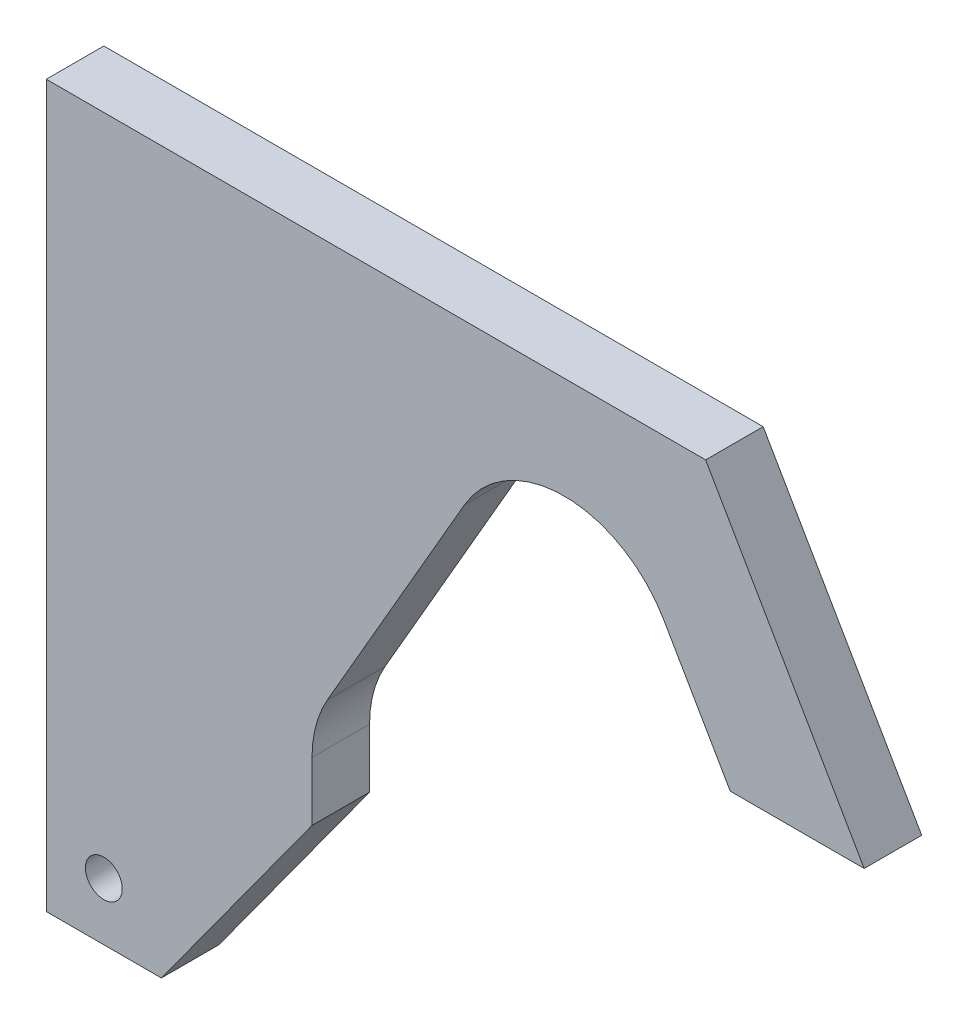
ISO-10303-21;
HEADER;
FILE_DESCRIPTION(('STEP AP214'),'2;1');
FILE_NAME('part.step','',(''),(''),'','','');
FILE_SCHEMA(('AUTOMOTIVE_DESIGN { 1 0 10303 214 1 1 1 1 }'));
ENDSEC;
DATA;
#1=APPLICATION_CONTEXT('core data for automotive mechanical design processes');
#2=APPLICATION_PROTOCOL_DEFINITION('international standard','automotive_design',2000,#1);
#3=PRODUCT_CONTEXT('',#1,'mechanical');
#4=PRODUCT('Part','Part','',(#3));
#5=PRODUCT_RELATED_PRODUCT_CATEGORY('part','',(#4));
#6=PRODUCT_DEFINITION_FORMATION('','',#4);
#7=PRODUCT_DEFINITION_CONTEXT('part definition',#1,'design');
#8=PRODUCT_DEFINITION('design','',#6,#7);
#9=PRODUCT_DEFINITION_SHAPE('','',#8);
#10=(LENGTH_UNIT() NAMED_UNIT(*) SI_UNIT(.MILLI.,.METRE.));
#11=(NAMED_UNIT(*) PLANE_ANGLE_UNIT() SI_UNIT($,.RADIAN.));
#12=(NAMED_UNIT(*) SI_UNIT($,.STERADIAN.) SOLID_ANGLE_UNIT());
#13=UNCERTAINTY_MEASURE_WITH_UNIT(LENGTH_MEASURE(1.E-05),#10,'distance_accuracy_value','');
#14=(GEOMETRIC_REPRESENTATION_CONTEXT(3) GLOBAL_UNCERTAINTY_ASSIGNED_CONTEXT((#13)) GLOBAL_UNIT_ASSIGNED_CONTEXT((#10,
#11,#12)) REPRESENTATION_CONTEXT('',''));
#15=CARTESIAN_POINT('',(0.,0.,0.));
#16=DIRECTION('',(0.,0.,1.));
#17=DIRECTION('',(1.,0.,0.));
#18=AXIS2_PLACEMENT_3D('',#15,#16,#17);
#19=CARTESIAN_POINT('',(0.,0.,6.35));
#20=DIRECTION('',(0.,0.,-1.));
#21=DIRECTION('',(-1.,0.,0.));
#22=AXIS2_PLACEMENT_3D('',#19,#20,#21);
#23=CYLINDRICAL_SURFACE('',#22,12.7);
#24=CARTESIAN_POINT('',(0.,0.,0.));
#25=DIRECTION('',(0.,0.,-1.));
#26=DIRECTION('',(1.,0.,0.));
#27=AXIS2_PLACEMENT_3D('',#24,#25,#26);
#28=CIRCLE('',#27,12.7);
#29=CARTESIAN_POINT('',(-10.9985226280624,6.35000000000001,0.));
#30=VERTEX_POINT('',#29);
#31=CARTESIAN_POINT('',(10.9985226280624,6.35000000000001,0.));
#32=VERTEX_POINT('',#31);
#33=EDGE_CURVE('E183',#30,#32,#28,.T.);
#34=ORIENTED_EDGE('',*,*,#33,.T.);
#35=DIRECTION('',(0.,0.,-1.));
#36=VECTOR('',#35,1.);
#37=CARTESIAN_POINT('',(10.9985226280624,6.35000000000001,6.35));
#38=LINE('',#37,#36);
#39=CARTESIAN_POINT('',(10.9985226280624,6.35000000000001,6.35));
#40=VERTEX_POINT('',#39);
#41=EDGE_CURVE('E11',#40,#32,#38,.T.);
#42=ORIENTED_EDGE('',*,*,#41,.F.);
#43=CARTESIAN_POINT('',(0.,0.,6.35));
#44=DIRECTION('',(0.,0.,-1.));
#45=DIRECTION('',(1.,0.,0.));
#46=AXIS2_PLACEMENT_3D('',#43,#44,#45);
#47=CIRCLE('',#46,12.7);
#48=CARTESIAN_POINT('',(-10.9985226280624,6.35000000000001,6.35));
#49=VERTEX_POINT('',#48);
#50=EDGE_CURVE('E215',#49,#40,#47,.T.);
#51=ORIENTED_EDGE('',*,*,#50,.F.);
#52=DIRECTION('',(0.,0.,-1.));
#53=VECTOR('',#52,1.);
#54=CARTESIAN_POINT('',(-10.9985226280624,6.35000000000001,6.35));
#55=LINE('',#54,#53);
#56=EDGE_CURVE('E179',#49,#30,#55,.T.);
#57=ORIENTED_EDGE('',*,*,#56,.T.);
#58=EDGE_LOOP('',(#34,#42,#51,#57));
#59=FACE_BOUND('',#58,.T.);
#60=ADVANCED_FACE('F49',(#59),#23,.F.);
#61=CARTESIAN_POINT('',(10.9985226280624,6.35000000000001,6.35));
#62=DIRECTION('',(0.866025403784438,0.500000000000001,0.));
#63=DIRECTION('',(-0.500000000000001,0.866025403784438,0.));
#64=AXIS2_PLACEMENT_3D('',#61,#62,#63);
#65=PLANE('',#64);
#66=DIRECTION('',(0.500000000000001,-0.866025403784438,0.));
#67=VECTOR('',#66,1.);
#68=CARTESIAN_POINT('',(10.9985226280624,6.35000000000001,0.));
#69=LINE('',#68,#67);
#70=CARTESIAN_POINT('',(18.3308710467706,-6.34999999999998,0.));
#71=VERTEX_POINT('',#70);
#72=EDGE_CURVE('E187',#32,#71,#69,.T.);
#73=ORIENTED_EDGE('',*,*,#72,.T.);
#74=DIRECTION('',(0.,0.,-1.));
#75=VECTOR('',#74,1.);
#76=CARTESIAN_POINT('',(18.3308710467706,-6.34999999999998,6.35));
#77=LINE('',#76,#75);
#78=CARTESIAN_POINT('',(18.3308710467706,-6.34999999999998,6.35));
#79=VERTEX_POINT('',#78);
#80=EDGE_CURVE('E58',#79,#71,#77,.T.);
#81=ORIENTED_EDGE('',*,*,#80,.F.);
#82=DIRECTION('',(0.500000000000001,-0.866025403784438,0.));
#83=VECTOR('',#82,1.);
#84=CARTESIAN_POINT('',(10.9985226280624,6.35000000000001,6.35));
#85=LINE('',#84,#83);
#86=EDGE_CURVE('E127',#40,#79,#85,.T.);
#87=ORIENTED_EDGE('',*,*,#86,.F.);
#88=ORIENTED_EDGE('',*,*,#41,.T.);
#89=EDGE_LOOP('',(#73,#81,#87,#88));
#90=FACE_BOUND('',#89,.T.);
#91=ADVANCED_FACE('F294',(#90),#65,.F.);
#92=CARTESIAN_POINT('',(33.1117687715967,-6.34999999999999,6.35));
#93=DIRECTION('',(0.,1.,0.));
#94=DIRECTION('',(-1.,0.,0.));
#95=AXIS2_PLACEMENT_3D('',#92,#93,#94);
#96=PLANE('',#95);
#97=DIRECTION('',(1.,0.,0.));
#98=VECTOR('',#97,1.);
#99=CARTESIAN_POINT('',(33.1117687715967,-6.34999999999999,0.));
#100=LINE('',#99,#98);
#101=CARTESIAN_POINT('',(33.1117687715967,-6.34999999999999,0.));
#102=VERTEX_POINT('',#101);
#103=EDGE_CURVE('E191',#71,#102,#100,.T.);
#104=ORIENTED_EDGE('',*,*,#103,.T.);
#105=DIRECTION('',(0.,0.,-1.));
#106=VECTOR('',#105,1.);
#107=CARTESIAN_POINT('',(33.1117687715967,-6.34999999999999,6.35));
#108=LINE('',#107,#106);
#109=CARTESIAN_POINT('',(33.1117687715967,-6.34999999999999,6.35));
#110=VERTEX_POINT('',#109);
#111=EDGE_CURVE('E237',#110,#102,#108,.T.);
#112=ORIENTED_EDGE('',*,*,#111,.F.);
#113=DIRECTION('',(1.,0.,0.));
#114=VECTOR('',#113,1.);
#115=CARTESIAN_POINT('',(33.1117687715967,-6.34999999999999,6.35));
#116=LINE('',#115,#114);
#117=EDGE_CURVE('E249',#79,#110,#116,.T.);
#118=ORIENTED_EDGE('',*,*,#117,.F.);
#119=ORIENTED_EDGE('',*,*,#80,.T.);
#120=EDGE_LOOP('',(#104,#112,#118,#119));
#121=FACE_BOUND('',#120,.T.);
#122=ADVANCED_FACE('F247',(#121),#96,.F.);
#123=CARTESIAN_POINT('',(15.6155667867773,23.9543107771948,6.35));
#124=DIRECTION('',(-0.866025403784439,-0.5,0.));
#125=DIRECTION('',(0.5,-0.866025403784439,0.));
#126=AXIS2_PLACEMENT_3D('',#123,#124,#125);
#127=PLANE('',#126);
#128=DIRECTION('',(-0.5,0.866025403784439,0.));
#129=VECTOR('',#128,1.);
#130=CARTESIAN_POINT('',(15.6155667867773,23.9543107771948,0.));
#131=LINE('',#130,#129);
#132=CARTESIAN_POINT('',(15.6155667867773,23.9543107771948,0.));
#133=VERTEX_POINT('',#132);
#134=EDGE_CURVE('E194',#102,#133,#131,.T.);
#135=ORIENTED_EDGE('',*,*,#134,.T.);
#136=DIRECTION('',(0.,0.,-1.));
#137=VECTOR('',#136,1.);
#138=CARTESIAN_POINT('',(15.6155667867773,23.9543107771948,6.35));
#139=LINE('',#138,#137);
#140=CARTESIAN_POINT('',(15.6155667867773,23.9543107771948,6.35));
#141=VERTEX_POINT('',#140);
#142=EDGE_CURVE('E233',#141,#133,#139,.T.);
#143=ORIENTED_EDGE('',*,*,#142,.F.);
#144=DIRECTION('',(-0.5,0.866025403784439,0.));
#145=VECTOR('',#144,1.);
#146=CARTESIAN_POINT('',(15.6155667867773,23.9543107771948,6.35));
#147=LINE('',#146,#145);
#148=EDGE_CURVE('E268',#110,#141,#147,.T.);
#149=ORIENTED_EDGE('',*,*,#148,.F.);
#150=ORIENTED_EDGE('',*,*,#111,.T.);
#151=EDGE_LOOP('',(#135,#143,#149,#150));
#152=FACE_BOUND('',#151,.T.);
#153=ADVANCED_FACE('F258',(#152),#127,.F.);
#154=CARTESIAN_POINT('',(15.6155667867773,23.9543107771948,6.35));
#155=DIRECTION('',(0.,-1.,0.));
#156=DIRECTION('',(1.,0.,0.));
#157=AXIS2_PLACEMENT_3D('',#154,#155,#156);
#158=PLANE('',#157);
#159=DIRECTION('',(-1.,0.,0.));
#160=VECTOR('',#159,1.);
#161=CARTESIAN_POINT('',(15.6155667867773,23.9543107771948,0.));
#162=LINE('',#161,#160);
#163=CARTESIAN_POINT('',(-57.15,23.9543107771947,0.));
#164=VERTEX_POINT('',#163);
#165=EDGE_CURVE('E197',#133,#164,#162,.T.);
#166=ORIENTED_EDGE('',*,*,#165,.T.);
#167=DIRECTION('',(0.,0.,-1.));
#168=VECTOR('',#167,1.);
#169=CARTESIAN_POINT('',(-57.15,23.9543107771947,6.35));
#170=LINE('',#169,#168);
#171=CARTESIAN_POINT('',(-57.15,23.9543107771947,6.35));
#172=VERTEX_POINT('',#171);
#173=EDGE_CURVE('E229',#172,#164,#170,.T.);
#174=ORIENTED_EDGE('',*,*,#173,.F.);
#175=DIRECTION('',(-1.,0.,0.));
#176=VECTOR('',#175,1.);
#177=CARTESIAN_POINT('',(15.6155667867773,23.9543107771948,6.35));
#178=LINE('',#177,#176);
#179=EDGE_CURVE('E264',#141,#172,#178,.T.);
#180=ORIENTED_EDGE('',*,*,#179,.F.);
#181=ORIENTED_EDGE('',*,*,#142,.T.);
#182=EDGE_LOOP('',(#166,#174,#180,#181));
#183=FACE_BOUND('',#182,.T.);
#184=ADVANCED_FACE('F262',(#183),#158,.F.);
#185=CARTESIAN_POINT('',(-57.15,23.9543107771947,6.35));
#186=DIRECTION('',(1.,0.,0.));
#187=DIRECTION('',(0.,1.,0.));
#188=AXIS2_PLACEMENT_3D('',#185,#186,#187);
#189=PLANE('',#188);
#190=DIRECTION('',(0.,-1.,0.));
#191=VECTOR('',#190,1.);
#192=CARTESIAN_POINT('',(-57.15,23.9543107771947,0.));
#193=LINE('',#192,#191);
#194=CARTESIAN_POINT('',(-57.15,-55.5985464151371,0.));
#195=VERTEX_POINT('',#194);
#196=EDGE_CURVE('E200',#164,#195,#193,.T.);
#197=ORIENTED_EDGE('',*,*,#196,.T.);
#198=DIRECTION('',(0.,0.,-1.));
#199=VECTOR('',#198,1.);
#200=CARTESIAN_POINT('',(-57.15,-55.5985464151371,6.35));
#201=LINE('',#200,#199);
#202=CARTESIAN_POINT('',(-57.15,-55.5985464151371,6.35));
#203=VERTEX_POINT('',#202);
#204=EDGE_CURVE('E225',#203,#195,#201,.T.);
#205=ORIENTED_EDGE('',*,*,#204,.F.);
#206=DIRECTION('',(0.,-1.,0.));
#207=VECTOR('',#206,1.);
#208=CARTESIAN_POINT('',(-57.15,23.9543107771947,6.35));
#209=LINE('',#208,#207);
#210=EDGE_CURVE('E267',#172,#203,#209,.T.);
#211=ORIENTED_EDGE('',*,*,#210,.F.);
#212=ORIENTED_EDGE('',*,*,#173,.T.);
#213=EDGE_LOOP('',(#197,#205,#211,#212));
#214=FACE_BOUND('',#213,.T.);
#215=ADVANCED_FACE('F306',(#214),#189,.F.);
#216=CARTESIAN_POINT('',(-44.45,-55.5985464151371,6.35));
#217=DIRECTION('',(0.,1.,0.));
#218=DIRECTION('',(0.,0.,1.));
#219=AXIS2_PLACEMENT_3D('',#216,#217,#218);
#220=PLANE('',#219);
#221=DIRECTION('',(1.,0.,0.));
#222=VECTOR('',#221,1.);
#223=CARTESIAN_POINT('',(-44.45,-55.5985464151371,0.));
#224=LINE('',#223,#222);
#225=CARTESIAN_POINT('',(-44.45,-55.5985464151371,0.));
#226=VERTEX_POINT('',#225);
#227=EDGE_CURVE('E203',#195,#226,#224,.T.);
#228=ORIENTED_EDGE('',*,*,#227,.T.);
#229=DIRECTION('',(0.,0.,-1.));
#230=VECTOR('',#229,1.);
#231=CARTESIAN_POINT('',(-44.45,-55.5985464151371,6.35));
#232=LINE('',#231,#230);
#233=CARTESIAN_POINT('',(-44.45,-55.5985464151371,6.35));
#234=VERTEX_POINT('',#233);
#235=EDGE_CURVE('E222',#234,#226,#232,.T.);
#236=ORIENTED_EDGE('',*,*,#235,.F.);
#237=DIRECTION('',(1.,0.,0.));
#238=VECTOR('',#237,1.);
#239=CARTESIAN_POINT('',(-44.45,-55.5985464151371,6.35));
#240=LINE('',#239,#238);
#241=EDGE_CURVE('E272',#203,#234,#240,.T.);
#242=ORIENTED_EDGE('',*,*,#241,.F.);
#243=ORIENTED_EDGE('',*,*,#204,.T.);
#244=EDGE_LOOP('',(#228,#236,#242,#243));
#245=FACE_BOUND('',#244,.T.);
#246=ADVANCED_FACE('F309',(#245),#220,.F.);
#247=CARTESIAN_POINT('',(-27.822968611,-32.7028208969072,6.35));
#248=DIRECTION('',(-0.809146156438205,0.587607434875767,0.));
#249=DIRECTION('',(-0.587607434875768,-0.809146156438205,0.));
#250=AXIS2_PLACEMENT_3D('',#247,#248,#249);
#251=PLANE('',#250);
#252=DIRECTION('',(0.587607434875768,0.809146156438205,0.));
#253=VECTOR('',#252,1.);
#254=CARTESIAN_POINT('',(-27.822968611,-32.7028208969072,0.));
#255=LINE('',#254,#253);
#256=CARTESIAN_POINT('',(-27.822968611,-32.7028208969072,0.));
#257=VERTEX_POINT('',#256);
#258=EDGE_CURVE('E206',#226,#257,#255,.T.);
#259=ORIENTED_EDGE('',*,*,#258,.T.);
#260=DIRECTION('',(0.,0.,-1.));
#261=VECTOR('',#260,1.);
#262=CARTESIAN_POINT('',(-27.822968611,-32.7028208969072,6.35));
#263=LINE('',#262,#261);
#264=CARTESIAN_POINT('',(-27.822968611,-32.7028208969072,6.35));
#265=VERTEX_POINT('',#264);
#266=EDGE_CURVE('E171',#265,#257,#263,.T.);
#267=ORIENTED_EDGE('',*,*,#266,.F.);
#268=DIRECTION('',(0.587607434875768,0.809146156438205,0.));
#269=VECTOR('',#268,1.);
#270=CARTESIAN_POINT('',(-27.822968611,-32.7028208969072,6.35));
#271=LINE('',#270,#269);
#272=EDGE_CURVE('E160',#234,#265,#271,.T.);
#273=ORIENTED_EDGE('',*,*,#272,.F.);
#274=ORIENTED_EDGE('',*,*,#235,.T.);
#275=EDGE_LOOP('',(#259,#267,#273,#274));
#276=FACE_BOUND('',#275,.T.);
#277=ADVANCED_FACE('F313',(#276),#251,.F.);
#278=CARTESIAN_POINT('',(-27.822968611,-26.1937499955213,6.35));
#279=DIRECTION('',(-1.,0.,0.));
#280=DIRECTION('',(0.,0.,1.));
#281=AXIS2_PLACEMENT_3D('',#278,#279,#280);
#282=PLANE('',#281);
#283=DIRECTION('',(0.,1.,0.));
#284=VECTOR('',#283,1.);
#285=CARTESIAN_POINT('',(-27.822968611,-26.1937499955213,0.));
#286=LINE('',#285,#284);
#287=CARTESIAN_POINT('',(-27.822968611,-26.1937499955213,0.));
#288=VERTEX_POINT('',#287);
#289=EDGE_CURVE('E169',#257,#288,#286,.T.);
#290=ORIENTED_EDGE('',*,*,#289,.T.);
#291=DIRECTION('',(0.,0.,-1.));
#292=VECTOR('',#291,1.);
#293=CARTESIAN_POINT('',(-27.822968611,-26.1937499955213,6.35));
#294=LINE('',#293,#292);
#295=CARTESIAN_POINT('',(-27.822968611,-26.1937499955213,6.35));
#296=VERTEX_POINT('',#295);
#297=EDGE_CURVE('E166',#296,#288,#294,.T.);
#298=ORIENTED_EDGE('',*,*,#297,.F.);
#299=DIRECTION('',(0.,1.,0.));
#300=VECTOR('',#299,1.);
#301=CARTESIAN_POINT('',(-27.822968611,-26.1937499955213,6.35));
#302=LINE('',#301,#300);
#303=EDGE_CURVE('E154',#265,#296,#302,.T.);
#304=ORIENTED_EDGE('',*,*,#303,.F.);
#305=ORIENTED_EDGE('',*,*,#266,.T.);
#306=EDGE_LOOP('',(#290,#298,#304,#305));
#307=FACE_BOUND('',#306,.T.);
#308=ADVANCED_FACE('F167',(#307),#282,.F.);
#309=CARTESIAN_POINT('',(-15.122968611,-26.1937499955213,6.35));
#310=DIRECTION('',(0.,0.,-1.));
#311=DIRECTION('',(-1.,0.,0.));
#312=AXIS2_PLACEMENT_3D('',#309,#310,#311);
#313=CYLINDRICAL_SURFACE('',#312,12.7);
#314=CARTESIAN_POINT('',(-15.122968611,-26.1937499955213,0.));
#315=DIRECTION('',(0.,0.,-1.));
#316=DIRECTION('',(1.,0.,0.));
#317=AXIS2_PLACEMENT_3D('',#314,#315,#316);
#318=CIRCLE('',#317,12.7);
#319=CARTESIAN_POINT('',(-26.1214912390624,-19.8437499955213,0.));
#320=VERTEX_POINT('',#319);
#321=EDGE_CURVE('E113',#288,#320,#318,.T.);
#322=ORIENTED_EDGE('',*,*,#321,.T.);
#323=DIRECTION('',(0.,0.,-1.));
#324=VECTOR('',#323,1.);
#325=CARTESIAN_POINT('',(-26.1214912390624,-19.8437499955213,6.35));
#326=LINE('',#325,#324);
#327=CARTESIAN_POINT('',(-26.1214912390624,-19.8437499955213,6.35));
#328=VERTEX_POINT('',#327);
#329=EDGE_CURVE('E172',#328,#320,#326,.T.);
#330=ORIENTED_EDGE('',*,*,#329,.F.);
#331=CARTESIAN_POINT('',(-15.122968611,-26.1937499955213,6.35));
#332=DIRECTION('',(0.,0.,-1.));
#333=DIRECTION('',(1.,0.,0.));
#334=AXIS2_PLACEMENT_3D('',#331,#332,#333);
#335=CIRCLE('',#334,12.7);
#336=EDGE_CURVE('E158',#296,#328,#335,.T.);
#337=ORIENTED_EDGE('',*,*,#336,.F.);
#338=ORIENTED_EDGE('',*,*,#297,.T.);
#339=EDGE_LOOP('',(#322,#330,#337,#338));
#340=FACE_BOUND('',#339,.T.);
#341=ADVANCED_FACE('F174',(#340),#313,.F.);
#342=CARTESIAN_POINT('',(-10.9985226280624,6.35000000000001,6.35));
#343=DIRECTION('',(-0.866025403784438,0.500000000000001,0.));
#344=DIRECTION('',(-0.500000000000001,-0.866025403784438,0.));
#345=AXIS2_PLACEMENT_3D('',#342,#343,#344);
#346=PLANE('',#345);
#347=DIRECTION('',(0.500000000000001,0.866025403784438,0.));
#348=VECTOR('',#347,1.);
#349=CARTESIAN_POINT('',(-10.9985226280624,6.35000000000001,0.));
#350=LINE('',#349,#348);
#351=EDGE_CURVE('E119',#320,#30,#350,.T.);
#352=ORIENTED_EDGE('',*,*,#351,.T.);
#353=ORIENTED_EDGE('',*,*,#56,.F.);
#354=DIRECTION('',(0.500000000000001,0.866025403784438,0.));
#355=VECTOR('',#354,1.);
#356=CARTESIAN_POINT('',(-10.9985226280624,6.35000000000001,6.35));
#357=LINE('',#356,#355);
#358=EDGE_CURVE('E66',#328,#49,#357,.T.);
#359=ORIENTED_EDGE('',*,*,#358,.F.);
#360=ORIENTED_EDGE('',*,*,#329,.T.);
#361=EDGE_LOOP('',(#352,#353,#359,#360));
#362=FACE_BOUND('',#361,.T.);
#363=ADVANCED_FACE('F322',(#362),#346,.F.);
#364=CARTESIAN_POINT('',(0.,0.,6.35));
#365=DIRECTION('',(0.,0.,1.));
#366=DIRECTION('',(1.,0.,0.));
#367=AXIS2_PLACEMENT_3D('',#364,#365,#366);
#368=PLANE('',#367);
#369=CARTESIAN_POINT('',(-50.8,-49.2485464151371,6.35));
#370=DIRECTION('',(0.,0.,1.));
#371=DIRECTION('',(1.,0.,0.));
#372=AXIS2_PLACEMENT_3D('',#369,#370,#371);
#373=CIRCLE('',#372,2.032);
#374=CARTESIAN_POINT('',(-48.768,-49.2485464151371,6.35));
#375=VERTEX_POINT('',#374);
#376=EDGE_CURVE('E281',#375,#375,#373,.T.);
#377=ORIENTED_EDGE('',*,*,#376,.F.);
#378=EDGE_LOOP('',(#377));
#379=FACE_BOUND('',#378,.T.);
#380=ORIENTED_EDGE('',*,*,#50,.T.);
#381=ORIENTED_EDGE('',*,*,#86,.T.);
#382=ORIENTED_EDGE('',*,*,#117,.T.);
#383=ORIENTED_EDGE('',*,*,#148,.T.);
#384=ORIENTED_EDGE('',*,*,#179,.T.);
#385=ORIENTED_EDGE('',*,*,#210,.T.);
#386=ORIENTED_EDGE('',*,*,#241,.T.);
#387=ORIENTED_EDGE('',*,*,#272,.T.);
#388=ORIENTED_EDGE('',*,*,#303,.T.);
#389=ORIENTED_EDGE('',*,*,#336,.T.);
#390=ORIENTED_EDGE('',*,*,#358,.T.);
#391=EDGE_LOOP('',(#380,#381,#382,#383,#384,#385,#386,#387,#388,#389,#390));
#392=FACE_BOUND('',#391,.T.);
#393=ADVANCED_FACE('F156',(#379,#392),#368,.T.);
#394=CARTESIAN_POINT('',(0.,0.,0.));
#395=DIRECTION('',(0.,0.,1.));
#396=DIRECTION('',(1.,0.,0.));
#397=AXIS2_PLACEMENT_3D('',#394,#395,#396);
#398=PLANE('',#397);
#399=CARTESIAN_POINT('',(-50.8,-49.2485464151371,0.));
#400=DIRECTION('',(0.,0.,1.));
#401=DIRECTION('',(1.,0.,0.));
#402=AXIS2_PLACEMENT_3D('',#399,#400,#401);
#403=CIRCLE('',#402,2.032);
#404=CARTESIAN_POINT('',(-48.768,-49.2485464151371,0.));
#405=VERTEX_POINT('',#404);
#406=EDGE_CURVE('E188',#405,#405,#403,.T.);
#407=ORIENTED_EDGE('',*,*,#406,.T.);
#408=EDGE_LOOP('',(#407));
#409=FACE_BOUND('',#408,.T.);
#410=ORIENTED_EDGE('',*,*,#33,.F.);
#411=ORIENTED_EDGE('',*,*,#351,.F.);
#412=ORIENTED_EDGE('',*,*,#321,.F.);
#413=ORIENTED_EDGE('',*,*,#289,.F.);
#414=ORIENTED_EDGE('',*,*,#258,.F.);
#415=ORIENTED_EDGE('',*,*,#227,.F.);
#416=ORIENTED_EDGE('',*,*,#196,.F.);
#417=ORIENTED_EDGE('',*,*,#165,.F.);
#418=ORIENTED_EDGE('',*,*,#134,.F.);
#419=ORIENTED_EDGE('',*,*,#103,.F.);
#420=ORIENTED_EDGE('',*,*,#72,.F.);
#421=EDGE_LOOP('',(#410,#411,#412,#413,#414,#415,#416,#417,#418,#419,#420));
#422=FACE_BOUND('',#421,.T.);
#423=ADVANCED_FACE('F253',(#409,#422),#398,.F.);
#424=CARTESIAN_POINT('',(-50.8,-49.2485464151371,0.));
#425=DIRECTION('',(0.,0.,1.));
#426=DIRECTION('',(1.,0.,0.));
#427=AXIS2_PLACEMENT_3D('',#424,#425,#426);
#428=CYLINDRICAL_SURFACE('',#427,2.032);
#429=ORIENTED_EDGE('',*,*,#406,.F.);
#430=EDGE_LOOP('',(#429));
#431=FACE_BOUND('',#430,.T.);
#432=ORIENTED_EDGE('',*,*,#376,.T.);
#433=EDGE_LOOP('',(#432));
#434=FACE_BOUND('',#433,.T.);
#435=ADVANCED_FACE('F327',(#431,#434),#428,.F.);
#436=CLOSED_SHELL('',(#60,#91,#122,#153,#184,#215,#246,#277,#308,#341,#363,#393,#423,#435));
#437=MANIFOLD_SOLID_BREP('B2',#436);
#438=ADVANCED_BREP_SHAPE_REPRESENTATION('',(#18,#437),#14);
#439=SHAPE_DEFINITION_REPRESENTATION(#9,#438);
ENDSEC;
END-ISO-10303-21;
